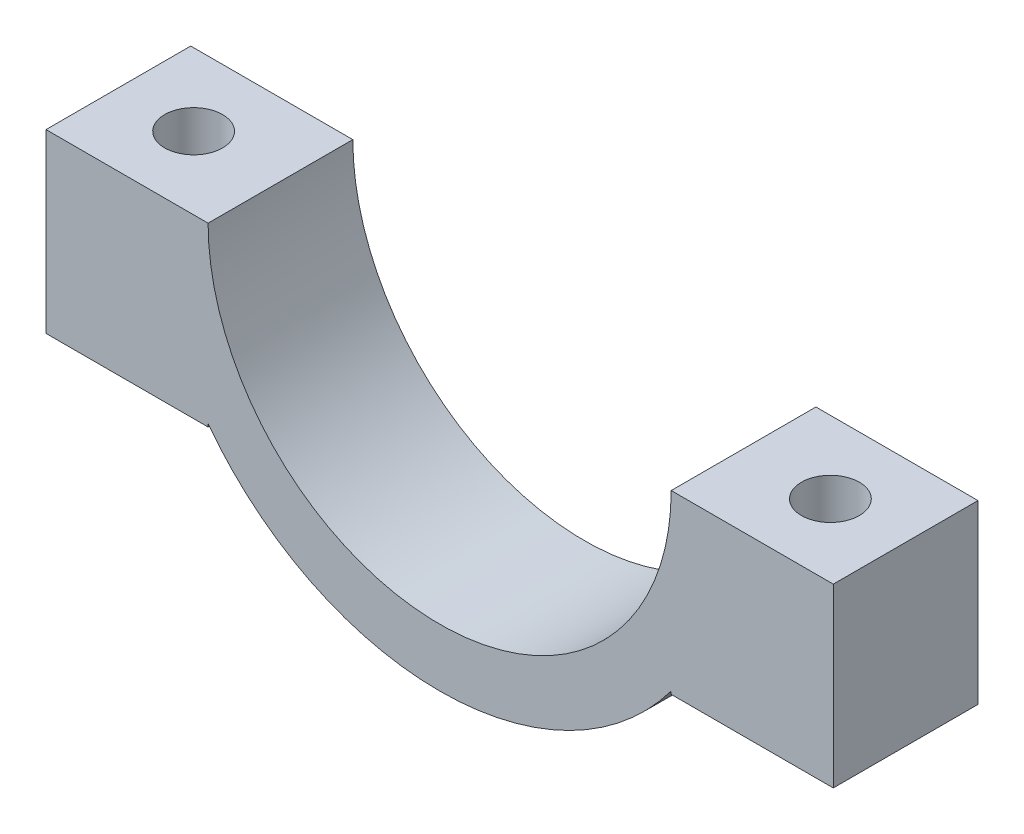
ISO-10303-21;
HEADER;
FILE_DESCRIPTION(('STEP AP214'),'2;1');
FILE_NAME('part.step','',(''),(''),'','','');
FILE_SCHEMA(('AUTOMOTIVE_DESIGN { 1 0 10303 214 1 1 1 1 }'));
ENDSEC;
DATA;
#1=APPLICATION_CONTEXT('core data for automotive mechanical design processes');
#2=APPLICATION_PROTOCOL_DEFINITION('international standard','automotive_design',2000,#1);
#3=PRODUCT_CONTEXT('',#1,'mechanical');
#4=PRODUCT('Part','Part','',(#3));
#5=PRODUCT_RELATED_PRODUCT_CATEGORY('part','',(#4));
#6=PRODUCT_DEFINITION_FORMATION('','',#4);
#7=PRODUCT_DEFINITION_CONTEXT('part definition',#1,'design');
#8=PRODUCT_DEFINITION('design','',#6,#7);
#9=PRODUCT_DEFINITION_SHAPE('','',#8);
#10=(LENGTH_UNIT() NAMED_UNIT(*) SI_UNIT(.MILLI.,.METRE.));
#11=(NAMED_UNIT(*) PLANE_ANGLE_UNIT() SI_UNIT($,.RADIAN.));
#12=(NAMED_UNIT(*) SI_UNIT($,.STERADIAN.) SOLID_ANGLE_UNIT());
#13=UNCERTAINTY_MEASURE_WITH_UNIT(LENGTH_MEASURE(1.E-05),#10,'distance_accuracy_value','');
#14=(GEOMETRIC_REPRESENTATION_CONTEXT(3) GLOBAL_UNCERTAINTY_ASSIGNED_CONTEXT((#13)) GLOBAL_UNIT_ASSIGNED_CONTEXT((#10,
#11,#12)) REPRESENTATION_CONTEXT('',''));
#15=CARTESIAN_POINT('',(0.,0.,0.));
#16=DIRECTION('',(0.,0.,1.));
#17=DIRECTION('',(1.,0.,0.));
#18=AXIS2_PLACEMENT_3D('',#15,#16,#17);
#19=CARTESIAN_POINT('',(-8.,0.,5.));
#20=DIRECTION('',(1.,0.,0.));
#21=DIRECTION('',(0.,1.,0.));
#22=AXIS2_PLACEMENT_3D('',#19,#20,#21);
#23=PLANE('',#22);
#24=DIRECTION('',(0.,-1.,0.));
#25=VECTOR('',#24,1.);
#26=CARTESIAN_POINT('',(-8.,0.,0.));
#27=LINE('',#26,#25);
#28=CARTESIAN_POINT('',(-8.,-6.00000000000001,0.));
#29=VERTEX_POINT('',#28);
#30=CARTESIAN_POINT('',(-8.,-6.1,0.));
#31=VERTEX_POINT('',#30);
#32=EDGE_CURVE('E138',#29,#31,#27,.T.);
#33=ORIENTED_EDGE('',*,*,#32,.F.);
#34=DIRECTION('',(0.,0.,-1.));
#35=VECTOR('',#34,1.);
#36=CARTESIAN_POINT('',(-8.,-6.00000000000001,5.));
#37=LINE('',#36,#35);
#38=CARTESIAN_POINT('',(-8.,-6.00000000000001,5.));
#39=VERTEX_POINT('',#38);
#40=EDGE_CURVE('E11',#39,#29,#37,.T.);
#41=ORIENTED_EDGE('',*,*,#40,.F.);
#42=DIRECTION('',(0.,-1.,0.));
#43=VECTOR('',#42,1.);
#44=CARTESIAN_POINT('',(-8.,0.,5.));
#45=LINE('',#44,#43);
#46=CARTESIAN_POINT('',(-8.,-6.1,5.));
#47=VERTEX_POINT('',#46);
#48=EDGE_CURVE('E162',#39,#47,#45,.T.);
#49=ORIENTED_EDGE('',*,*,#48,.T.);
#50=DIRECTION('',(0.,0.,-1.));
#51=VECTOR('',#50,1.);
#52=CARTESIAN_POINT('',(-8.,-6.1,5.));
#53=LINE('',#52,#51);
#54=EDGE_CURVE('E90',#47,#31,#53,.T.);
#55=ORIENTED_EDGE('',*,*,#54,.T.);
#56=EDGE_LOOP('',(#33,#41,#49,#55));
#57=FACE_BOUND('',#56,.T.);
#58=ADVANCED_FACE('F32',(#57),#23,.T.);
#59=CARTESIAN_POINT('',(0.,0.,5.));
#60=DIRECTION('',(0.,0.,-1.));
#61=DIRECTION('',(-1.,0.,0.));
#62=AXIS2_PLACEMENT_3D('',#59,#60,#61);
#63=CYLINDRICAL_SURFACE('',#62,10.);
#64=CARTESIAN_POINT('',(0.,0.,0.));
#65=DIRECTION('',(0.,0.,1.));
#66=DIRECTION('',(1.,0.,0.));
#67=AXIS2_PLACEMENT_3D('',#64,#65,#66);
#68=CIRCLE('',#67,10.);
#69=CARTESIAN_POINT('',(8.,-6.,0.));
#70=VERTEX_POINT('',#69);
#71=EDGE_CURVE('E141',#29,#70,#68,.T.);
#72=ORIENTED_EDGE('',*,*,#71,.T.);
#73=DIRECTION('',(0.,0.,-1.));
#74=VECTOR('',#73,1.);
#75=CARTESIAN_POINT('',(8.,-6.,5.));
#76=LINE('',#75,#74);
#77=CARTESIAN_POINT('',(8.,-6.,5.));
#78=VERTEX_POINT('',#77);
#79=EDGE_CURVE('E41',#78,#70,#76,.T.);
#80=ORIENTED_EDGE('',*,*,#79,.F.);
#81=CARTESIAN_POINT('',(0.,0.,5.));
#82=DIRECTION('',(0.,0.,1.));
#83=DIRECTION('',(1.,0.,0.));
#84=AXIS2_PLACEMENT_3D('',#81,#82,#83);
#85=CIRCLE('',#84,10.);
#86=EDGE_CURVE('E199',#39,#78,#85,.T.);
#87=ORIENTED_EDGE('',*,*,#86,.F.);
#88=ORIENTED_EDGE('',*,*,#40,.T.);
#89=EDGE_LOOP('',(#72,#80,#87,#88));
#90=FACE_BOUND('',#89,.T.);
#91=ADVANCED_FACE('F239',(#90),#63,.T.);
#92=CARTESIAN_POINT('',(8.,0.,5.));
#93=DIRECTION('',(1.,0.,0.));
#94=DIRECTION('',(0.,0.,-1.));
#95=AXIS2_PLACEMENT_3D('',#92,#93,#94);
#96=PLANE('',#95);
#97=DIRECTION('',(0.,-1.,0.));
#98=VECTOR('',#97,1.);
#99=CARTESIAN_POINT('',(8.,0.,0.));
#100=LINE('',#99,#98);
#101=CARTESIAN_POINT('',(8.,-6.1,0.));
#102=VERTEX_POINT('',#101);
#103=EDGE_CURVE('E143',#70,#102,#100,.T.);
#104=ORIENTED_EDGE('',*,*,#103,.T.);
#105=DIRECTION('',(0.,0.,-1.));
#106=VECTOR('',#105,1.);
#107=CARTESIAN_POINT('',(8.,-6.1,5.));
#108=LINE('',#107,#106);
#109=CARTESIAN_POINT('',(8.,-6.1,5.));
#110=VERTEX_POINT('',#109);
#111=EDGE_CURVE('E172',#110,#102,#108,.T.);
#112=ORIENTED_EDGE('',*,*,#111,.F.);
#113=DIRECTION('',(0.,-1.,0.));
#114=VECTOR('',#113,1.);
#115=CARTESIAN_POINT('',(8.,0.,5.));
#116=LINE('',#115,#114);
#117=EDGE_CURVE('E181',#78,#110,#116,.T.);
#118=ORIENTED_EDGE('',*,*,#117,.F.);
#119=ORIENTED_EDGE('',*,*,#79,.T.);
#120=EDGE_LOOP('',(#104,#112,#118,#119));
#121=FACE_BOUND('',#120,.T.);
#122=ADVANCED_FACE('F179',(#121),#96,.F.);
#123=CARTESIAN_POINT('',(0.,-6.1,5.));
#124=DIRECTION('',(0.,-1.,0.));
#125=DIRECTION('',(1.,0.,0.));
#126=AXIS2_PLACEMENT_3D('',#123,#124,#125);
#127=PLANE('',#126);
#128=CARTESIAN_POINT('',(11.,-6.1,2.49999999999884));
#129=DIRECTION('',(0.,-1.,0.));
#130=DIRECTION('',(1.,0.,0.));
#131=AXIS2_PLACEMENT_3D('',#128,#129,#130);
#132=CIRCLE('',#131,1.);
#133=CARTESIAN_POINT('',(12.,-6.1,2.49999999999884));
#134=VERTEX_POINT('',#133);
#135=EDGE_CURVE('E216',#134,#134,#132,.T.);
#136=ORIENTED_EDGE('',*,*,#135,.F.);
#137=EDGE_LOOP('',(#136));
#138=FACE_BOUND('',#137,.T.);
#139=DIRECTION('',(-1.,0.,0.));
#140=VECTOR('',#139,1.);
#141=CARTESIAN_POINT('',(0.,-6.1,0.));
#142=LINE('',#141,#140);
#143=CARTESIAN_POINT('',(13.6,-6.1,0.));
#144=VERTEX_POINT('',#143);
#145=EDGE_CURVE('E146',#144,#102,#142,.T.);
#146=ORIENTED_EDGE('',*,*,#145,.F.);
#147=DIRECTION('',(0.,0.,-1.));
#148=VECTOR('',#147,1.);
#149=CARTESIAN_POINT('',(13.6,-6.1,5.));
#150=LINE('',#149,#148);
#151=CARTESIAN_POINT('',(13.6,-6.1,5.));
#152=VERTEX_POINT('',#151);
#153=EDGE_CURVE('E170',#152,#144,#150,.T.);
#154=ORIENTED_EDGE('',*,*,#153,.F.);
#155=DIRECTION('',(-1.,0.,0.));
#156=VECTOR('',#155,1.);
#157=CARTESIAN_POINT('',(0.,-6.1,5.));
#158=LINE('',#157,#156);
#159=EDGE_CURVE('E192',#152,#110,#158,.T.);
#160=ORIENTED_EDGE('',*,*,#159,.T.);
#161=ORIENTED_EDGE('',*,*,#111,.T.);
#162=EDGE_LOOP('',(#146,#154,#160,#161));
#163=FACE_BOUND('',#162,.T.);
#164=ADVANCED_FACE('F189',(#138,#163),#127,.T.);
#165=CARTESIAN_POINT('',(13.6,0.,5.));
#166=DIRECTION('',(1.,0.,0.));
#167=DIRECTION('',(0.,0.,-1.));
#168=AXIS2_PLACEMENT_3D('',#165,#166,#167);
#169=PLANE('',#168);
#170=DIRECTION('',(0.,-1.,0.));
#171=VECTOR('',#170,1.);
#172=CARTESIAN_POINT('',(13.6,0.,0.));
#173=LINE('',#172,#171);
#174=CARTESIAN_POINT('',(13.6,0.,0.));
#175=VERTEX_POINT('',#174);
#176=EDGE_CURVE('E149',#175,#144,#173,.T.);
#177=ORIENTED_EDGE('',*,*,#176,.F.);
#178=DIRECTION('',(0.,0.,-1.));
#179=VECTOR('',#178,1.);
#180=CARTESIAN_POINT('',(13.6,0.,5.));
#181=LINE('',#180,#179);
#182=CARTESIAN_POINT('',(13.6,0.,5.));
#183=VERTEX_POINT('',#182);
#184=EDGE_CURVE('E168',#183,#175,#181,.T.);
#185=ORIENTED_EDGE('',*,*,#184,.F.);
#186=DIRECTION('',(0.,-1.,0.));
#187=VECTOR('',#186,1.);
#188=CARTESIAN_POINT('',(13.6,0.,5.));
#189=LINE('',#188,#187);
#190=EDGE_CURVE('E195',#183,#152,#189,.T.);
#191=ORIENTED_EDGE('',*,*,#190,.T.);
#192=ORIENTED_EDGE('',*,*,#153,.T.);
#193=EDGE_LOOP('',(#177,#185,#191,#192));
#194=FACE_BOUND('',#193,.T.);
#195=ADVANCED_FACE('F228',(#194),#169,.T.);
#196=CARTESIAN_POINT('',(0.,0.,5.));
#197=DIRECTION('',(0.,1.,0.));
#198=DIRECTION('',(0.,0.,1.));
#199=AXIS2_PLACEMENT_3D('',#196,#197,#198);
#200=PLANE('',#199);
#201=CARTESIAN_POINT('',(11.,0.,2.49999999999884));
#202=DIRECTION('',(0.,1.,0.));
#203=DIRECTION('',(-1.,0.,0.));
#204=AXIS2_PLACEMENT_3D('',#201,#202,#203);
#205=CIRCLE('',#204,1.);
#206=CARTESIAN_POINT('',(10.,0.,2.49999999999884));
#207=VERTEX_POINT('',#206);
#208=EDGE_CURVE('E219',#207,#207,#205,.T.);
#209=ORIENTED_EDGE('',*,*,#208,.F.);
#210=EDGE_LOOP('',(#209));
#211=FACE_BOUND('',#210,.T.);
#212=DIRECTION('',(1.,0.,0.));
#213=VECTOR('',#212,1.);
#214=CARTESIAN_POINT('',(0.,0.,0.));
#215=LINE('',#214,#213);
#216=CARTESIAN_POINT('',(8.,0.,0.));
#217=VERTEX_POINT('',#216);
#218=EDGE_CURVE('E152',#217,#175,#215,.T.);
#219=ORIENTED_EDGE('',*,*,#218,.F.);
#220=DIRECTION('',(0.,0.,-1.));
#221=VECTOR('',#220,1.);
#222=CARTESIAN_POINT('',(8.,0.,5.));
#223=LINE('',#222,#221);
#224=CARTESIAN_POINT('',(8.,0.,5.));
#225=VERTEX_POINT('',#224);
#226=EDGE_CURVE('E166',#225,#217,#223,.T.);
#227=ORIENTED_EDGE('',*,*,#226,.F.);
#228=DIRECTION('',(1.,0.,0.));
#229=VECTOR('',#228,1.);
#230=CARTESIAN_POINT('',(0.,0.,5.));
#231=LINE('',#230,#229);
#232=EDGE_CURVE('E197',#225,#183,#231,.T.);
#233=ORIENTED_EDGE('',*,*,#232,.T.);
#234=ORIENTED_EDGE('',*,*,#184,.T.);
#235=EDGE_LOOP('',(#219,#227,#233,#234));
#236=FACE_BOUND('',#235,.T.);
#237=ADVANCED_FACE('F225',(#211,#236),#200,.T.);
#238=CARTESIAN_POINT('',(0.,0.,5.));
#239=DIRECTION('',(0.,0.,-1.));
#240=DIRECTION('',(-1.,0.,0.));
#241=AXIS2_PLACEMENT_3D('',#238,#239,#240);
#242=CYLINDRICAL_SURFACE('',#241,8.);
#243=CARTESIAN_POINT('',(0.,0.,0.));
#244=DIRECTION('',(0.,0.,1.));
#245=DIRECTION('',(1.,0.,0.));
#246=AXIS2_PLACEMENT_3D('',#243,#244,#245);
#247=CIRCLE('',#246,8.);
#248=CARTESIAN_POINT('',(-8.,0.,0.));
#249=VERTEX_POINT('',#248);
#250=EDGE_CURVE('E155',#249,#217,#247,.T.);
#251=ORIENTED_EDGE('',*,*,#250,.F.);
#252=DIRECTION('',(0.,0.,-1.));
#253=VECTOR('',#252,1.);
#254=CARTESIAN_POINT('',(-8.,0.,5.));
#255=LINE('',#254,#253);
#256=CARTESIAN_POINT('',(-8.,0.,5.));
#257=VERTEX_POINT('',#256);
#258=EDGE_CURVE('E130',#257,#249,#255,.T.);
#259=ORIENTED_EDGE('',*,*,#258,.F.);
#260=CARTESIAN_POINT('',(0.,0.,5.));
#261=DIRECTION('',(0.,0.,1.));
#262=DIRECTION('',(1.,0.,0.));
#263=AXIS2_PLACEMENT_3D('',#260,#261,#262);
#264=CIRCLE('',#263,8.);
#265=EDGE_CURVE('E123',#257,#225,#264,.T.);
#266=ORIENTED_EDGE('',*,*,#265,.T.);
#267=ORIENTED_EDGE('',*,*,#226,.T.);
#268=EDGE_LOOP('',(#251,#259,#266,#267));
#269=FACE_BOUND('',#268,.T.);
#270=ADVANCED_FACE('F206',(#269),#242,.F.);
#271=CARTESIAN_POINT('',(0.,0.,5.));
#272=DIRECTION('',(0.,-1.,0.));
#273=DIRECTION('',(1.,0.,0.));
#274=AXIS2_PLACEMENT_3D('',#271,#272,#273);
#275=PLANE('',#274);
#276=CARTESIAN_POINT('',(-11.,0.,2.49999999999886));
#277=DIRECTION('',(0.,1.,0.));
#278=DIRECTION('',(-1.,0.,0.));
#279=AXIS2_PLACEMENT_3D('',#276,#277,#278);
#280=CIRCLE('',#279,1.);
#281=CARTESIAN_POINT('',(-12.,0.,2.49999999999886));
#282=VERTEX_POINT('',#281);
#283=EDGE_CURVE('E213',#282,#282,#280,.T.);
#284=ORIENTED_EDGE('',*,*,#283,.F.);
#285=EDGE_LOOP('',(#284));
#286=FACE_BOUND('',#285,.T.);
#287=DIRECTION('',(-1.,0.,0.));
#288=VECTOR('',#287,1.);
#289=CARTESIAN_POINT('',(0.,0.,0.));
#290=LINE('',#289,#288);
#291=CARTESIAN_POINT('',(-13.6,0.,0.));
#292=VERTEX_POINT('',#291);
#293=EDGE_CURVE('E129',#249,#292,#290,.T.);
#294=ORIENTED_EDGE('',*,*,#293,.T.);
#295=DIRECTION('',(0.,0.,-1.));
#296=VECTOR('',#295,1.);
#297=CARTESIAN_POINT('',(-13.6,0.,5.));
#298=LINE('',#297,#296);
#299=CARTESIAN_POINT('',(-13.6,0.,5.));
#300=VERTEX_POINT('',#299);
#301=EDGE_CURVE('E126',#300,#292,#298,.T.);
#302=ORIENTED_EDGE('',*,*,#301,.F.);
#303=DIRECTION('',(-1.,0.,0.));
#304=VECTOR('',#303,1.);
#305=CARTESIAN_POINT('',(0.,0.,5.));
#306=LINE('',#305,#304);
#307=EDGE_CURVE('E116',#257,#300,#306,.T.);
#308=ORIENTED_EDGE('',*,*,#307,.F.);
#309=ORIENTED_EDGE('',*,*,#258,.T.);
#310=EDGE_LOOP('',(#294,#302,#308,#309));
#311=FACE_BOUND('',#310,.T.);
#312=ADVANCED_FACE('F127',(#286,#311),#275,.F.);
#313=CARTESIAN_POINT('',(-13.6,0.,5.));
#314=DIRECTION('',(1.,0.,0.));
#315=DIRECTION('',(0.,0.,-1.));
#316=AXIS2_PLACEMENT_3D('',#313,#314,#315);
#317=PLANE('',#316);
#318=DIRECTION('',(0.,-1.,0.));
#319=VECTOR('',#318,1.);
#320=CARTESIAN_POINT('',(-13.6,0.,0.));
#321=LINE('',#320,#319);
#322=CARTESIAN_POINT('',(-13.6,-6.1,0.));
#323=VERTEX_POINT('',#322);
#324=EDGE_CURVE('E83',#292,#323,#321,.T.);
#325=ORIENTED_EDGE('',*,*,#324,.T.);
#326=DIRECTION('',(0.,0.,-1.));
#327=VECTOR('',#326,1.);
#328=CARTESIAN_POINT('',(-13.6,-6.1,5.));
#329=LINE('',#328,#327);
#330=CARTESIAN_POINT('',(-13.6,-6.1,5.));
#331=VERTEX_POINT('',#330);
#332=EDGE_CURVE('E131',#331,#323,#329,.T.);
#333=ORIENTED_EDGE('',*,*,#332,.F.);
#334=DIRECTION('',(0.,-1.,0.));
#335=VECTOR('',#334,1.);
#336=CARTESIAN_POINT('',(-13.6,0.,5.));
#337=LINE('',#336,#335);
#338=EDGE_CURVE('E120',#300,#331,#337,.T.);
#339=ORIENTED_EDGE('',*,*,#338,.F.);
#340=ORIENTED_EDGE('',*,*,#301,.T.);
#341=EDGE_LOOP('',(#325,#333,#339,#340));
#342=FACE_BOUND('',#341,.T.);
#343=ADVANCED_FACE('F133',(#342),#317,.F.);
#344=CARTESIAN_POINT('',(0.,-6.1,5.));
#345=DIRECTION('',(0.,1.,0.));
#346=DIRECTION('',(0.,0.,1.));
#347=AXIS2_PLACEMENT_3D('',#344,#345,#346);
#348=PLANE('',#347);
#349=CARTESIAN_POINT('',(-11.,-6.1,2.49999999999886));
#350=DIRECTION('',(0.,1.,0.));
#351=DIRECTION('',(0.,0.,1.));
#352=AXIS2_PLACEMENT_3D('',#349,#350,#351);
#353=CIRCLE('',#352,1.);
#354=CARTESIAN_POINT('',(-11.,-6.1,3.49999999999886));
#355=VERTEX_POINT('',#354);
#356=EDGE_CURVE('E35',#355,#355,#353,.T.);
#357=ORIENTED_EDGE('',*,*,#356,.T.);
#358=EDGE_LOOP('',(#357));
#359=FACE_BOUND('',#358,.T.);
#360=DIRECTION('',(1.,0.,0.));
#361=VECTOR('',#360,1.);
#362=CARTESIAN_POINT('',(0.,-6.1,0.));
#363=LINE('',#362,#361);
#364=EDGE_CURVE('E160',#323,#31,#363,.T.);
#365=ORIENTED_EDGE('',*,*,#364,.T.);
#366=ORIENTED_EDGE('',*,*,#54,.F.);
#367=DIRECTION('',(1.,0.,0.));
#368=VECTOR('',#367,1.);
#369=CARTESIAN_POINT('',(0.,-6.1,5.));
#370=LINE('',#369,#368);
#371=EDGE_CURVE('E49',#331,#47,#370,.T.);
#372=ORIENTED_EDGE('',*,*,#371,.F.);
#373=ORIENTED_EDGE('',*,*,#332,.T.);
#374=EDGE_LOOP('',(#365,#366,#372,#373));
#375=FACE_BOUND('',#374,.T.);
#376=ADVANCED_FACE('F210',(#359,#375),#348,.F.);
#377=CARTESIAN_POINT('',(0.,0.,5.));
#378=DIRECTION('',(0.,0.,1.));
#379=DIRECTION('',(1.,0.,0.));
#380=AXIS2_PLACEMENT_3D('',#377,#378,#379);
#381=PLANE('',#380);
#382=ORIENTED_EDGE('',*,*,#48,.F.);
#383=ORIENTED_EDGE('',*,*,#86,.T.);
#384=ORIENTED_EDGE('',*,*,#117,.T.);
#385=ORIENTED_EDGE('',*,*,#159,.F.);
#386=ORIENTED_EDGE('',*,*,#190,.F.);
#387=ORIENTED_EDGE('',*,*,#232,.F.);
#388=ORIENTED_EDGE('',*,*,#265,.F.);
#389=ORIENTED_EDGE('',*,*,#307,.T.);
#390=ORIENTED_EDGE('',*,*,#338,.T.);
#391=ORIENTED_EDGE('',*,*,#371,.T.);
#392=EDGE_LOOP('',(#382,#383,#384,#385,#386,#387,#388,#389,#390,#391));
#393=FACE_BOUND('',#392,.T.);
#394=ADVANCED_FACE('F118',(#393),#381,.T.);
#395=CARTESIAN_POINT('',(0.,0.,0.));
#396=DIRECTION('',(0.,0.,1.));
#397=DIRECTION('',(1.,0.,0.));
#398=AXIS2_PLACEMENT_3D('',#395,#396,#397);
#399=PLANE('',#398);
#400=ORIENTED_EDGE('',*,*,#32,.T.);
#401=ORIENTED_EDGE('',*,*,#364,.F.);
#402=ORIENTED_EDGE('',*,*,#324,.F.);
#403=ORIENTED_EDGE('',*,*,#293,.F.);
#404=ORIENTED_EDGE('',*,*,#250,.T.);
#405=ORIENTED_EDGE('',*,*,#218,.T.);
#406=ORIENTED_EDGE('',*,*,#176,.T.);
#407=ORIENTED_EDGE('',*,*,#145,.T.);
#408=ORIENTED_EDGE('',*,*,#103,.F.);
#409=ORIENTED_EDGE('',*,*,#71,.F.);
#410=EDGE_LOOP('',(#400,#401,#402,#403,#404,#405,#406,#407,#408,#409));
#411=FACE_BOUND('',#410,.T.);
#412=ADVANCED_FACE('F185',(#411),#399,.F.);
#413=CARTESIAN_POINT('',(-11.,-10.,2.49999999999886));
#414=DIRECTION('',(0.,1.,0.));
#415=DIRECTION('',(-1.,0.,0.));
#416=AXIS2_PLACEMENT_3D('',#413,#414,#415);
#417=CYLINDRICAL_SURFACE('',#416,1.);
#418=ORIENTED_EDGE('',*,*,#283,.T.);
#419=EDGE_LOOP('',(#418));
#420=FACE_BOUND('',#419,.T.);
#421=ORIENTED_EDGE('',*,*,#356,.F.);
#422=EDGE_LOOP('',(#421));
#423=FACE_BOUND('',#422,.T.);
#424=ADVANCED_FACE('F296',(#420,#423),#417,.F.);
#425=CARTESIAN_POINT('',(11.,-10.,2.49999999999884));
#426=DIRECTION('',(0.,1.,0.));
#427=DIRECTION('',(-1.,0.,0.));
#428=AXIS2_PLACEMENT_3D('',#425,#426,#427);
#429=CYLINDRICAL_SURFACE('',#428,1.);
#430=ORIENTED_EDGE('',*,*,#135,.T.);
#431=EDGE_LOOP('',(#430));
#432=FACE_BOUND('',#431,.T.);
#433=ORIENTED_EDGE('',*,*,#208,.T.);
#434=EDGE_LOOP('',(#433));
#435=FACE_BOUND('',#434,.T.);
#436=ADVANCED_FACE('F223',(#432,#435),#429,.F.);
#437=CLOSED_SHELL('',(#58,#91,#122,#164,#195,#237,#270,#312,#343,#376,#394,#412,#424,#436));
#438=MANIFOLD_SOLID_BREP('B2',#437);
#439=ADVANCED_BREP_SHAPE_REPRESENTATION('',(#18,#438),#14);
#440=SHAPE_DEFINITION_REPRESENTATION(#9,#439);
ENDSEC;
END-ISO-10303-21;
